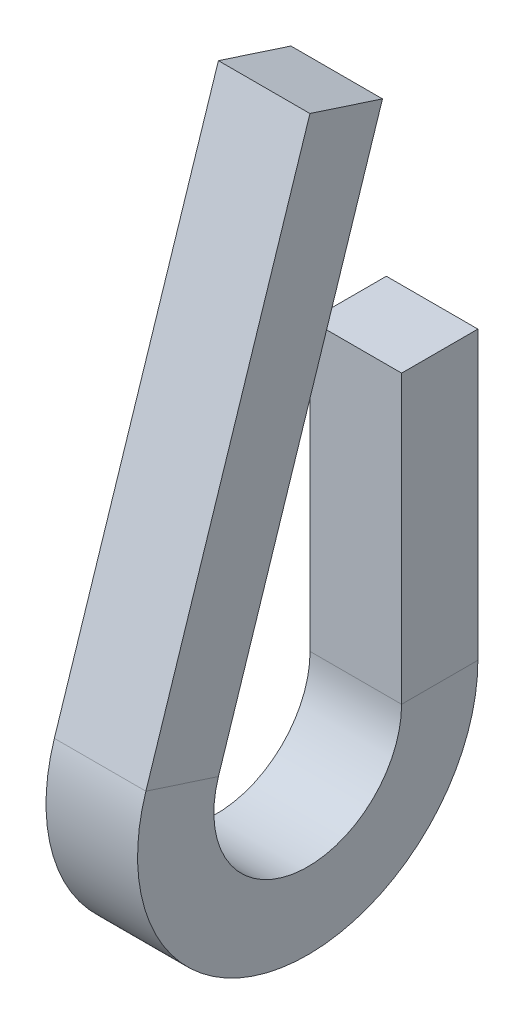
ISO-10303-21;
HEADER;
FILE_DESCRIPTION(('STEP AP214'),'2;1');
FILE_NAME('part.step','',(''),(''),'','','');
FILE_SCHEMA(('AUTOMOTIVE_DESIGN { 1 0 10303 214 1 1 1 1 }'));
ENDSEC;
DATA;
#1=APPLICATION_CONTEXT('core data for automotive mechanical design processes');
#2=APPLICATION_PROTOCOL_DEFINITION('international standard','automotive_design',2000,#1);
#3=PRODUCT_CONTEXT('',#1,'mechanical');
#4=PRODUCT('Part','Part','',(#3));
#5=PRODUCT_RELATED_PRODUCT_CATEGORY('part','',(#4));
#6=PRODUCT_DEFINITION_FORMATION('','',#4);
#7=PRODUCT_DEFINITION_CONTEXT('part definition',#1,'design');
#8=PRODUCT_DEFINITION('design','',#6,#7);
#9=PRODUCT_DEFINITION_SHAPE('','',#8);
#10=(LENGTH_UNIT() NAMED_UNIT(*) SI_UNIT(.MILLI.,.METRE.));
#11=(NAMED_UNIT(*) PLANE_ANGLE_UNIT() SI_UNIT($,.RADIAN.));
#12=(NAMED_UNIT(*) SI_UNIT($,.STERADIAN.) SOLID_ANGLE_UNIT());
#13=UNCERTAINTY_MEASURE_WITH_UNIT(LENGTH_MEASURE(1.E-05),#10,'distance_accuracy_value','');
#14=(GEOMETRIC_REPRESENTATION_CONTEXT(3) GLOBAL_UNCERTAINTY_ASSIGNED_CONTEXT((#13)) GLOBAL_UNIT_ASSIGNED_CONTEXT((#10,
#11,#12)) REPRESENTATION_CONTEXT('',''));
#15=CARTESIAN_POINT('',(0.,0.,0.));
#16=DIRECTION('',(0.,0.,1.));
#17=DIRECTION('',(1.,0.,0.));
#18=AXIS2_PLACEMENT_3D('',#15,#16,#17);
#19=CARTESIAN_POINT('',(0.,0.,0.));
#20=DIRECTION('',(0.,-1.,0.));
#21=DIRECTION('',(0.,0.,-1.));
#22=AXIS2_PLACEMENT_3D('',#19,#20,#21);
#23=PLANE('',#22);
#24=DIRECTION('',(0.,0.,-1.));
#25=VECTOR('',#24,1.);
#26=CARTESIAN_POINT('',(6.,0.,5.));
#27=LINE('',#26,#25);
#28=CARTESIAN_POINT('',(6.,0.,5.));
#29=VERTEX_POINT('',#28);
#30=CARTESIAN_POINT('',(6.,0.,-5.));
#31=VERTEX_POINT('',#30);
#32=EDGE_CURVE('E116',#29,#31,#27,.T.);
#33=ORIENTED_EDGE('',*,*,#32,.T.);
#34=DIRECTION('',(-1.,0.,0.));
#35=VECTOR('',#34,1.);
#36=CARTESIAN_POINT('',(-6.,0.,-5.));
#37=LINE('',#36,#35);
#38=CARTESIAN_POINT('',(-6.,0.,-5.));
#39=VERTEX_POINT('',#38);
#40=EDGE_CURVE('E126',#31,#39,#37,.T.);
#41=ORIENTED_EDGE('',*,*,#40,.T.);
#42=DIRECTION('',(0.,0.,1.));
#43=VECTOR('',#42,1.);
#44=CARTESIAN_POINT('',(-6.,0.,5.));
#45=LINE('',#44,#43);
#46=CARTESIAN_POINT('',(-6.,0.,5.));
#47=VERTEX_POINT('',#46);
#48=EDGE_CURVE('E130',#39,#47,#45,.T.);
#49=ORIENTED_EDGE('',*,*,#48,.T.);
#50=DIRECTION('',(1.,0.,0.));
#51=VECTOR('',#50,1.);
#52=CARTESIAN_POINT('',(-6.,0.,5.));
#53=LINE('',#52,#51);
#54=EDGE_CURVE('E129',#47,#29,#53,.T.);
#55=ORIENTED_EDGE('',*,*,#54,.T.);
#56=EDGE_LOOP('',(#33,#41,#49,#55));
#57=FACE_BOUND('',#56,.T.);
#58=ADVANCED_FACE('F32',(#57),#23,.F.);
#59=CARTESIAN_POINT('',(0.,33.9359199941308,12.2630312388335));
#60=DIRECTION('',(0.,0.95105651629522,-0.309016994374742));
#61=DIRECTION('',(0.,0.309016994374742,0.95105651629522));
#62=AXIS2_PLACEMENT_3D('',#59,#60,#61);
#63=PLANE('',#62);
#64=DIRECTION('',(0.,0.309016994374742,0.95105651629522));
#65=VECTOR('',#64,1.);
#66=CARTESIAN_POINT('',(6.,32.3908350222571,7.50774865735737));
#67=LINE('',#66,#65);
#68=CARTESIAN_POINT('',(6.,32.3908350222571,7.50774865735737));
#69=VERTEX_POINT('',#68);
#70=CARTESIAN_POINT('',(6.,35.4810049660045,17.0183138203096));
#71=VERTEX_POINT('',#70);
#72=EDGE_CURVE('E151',#69,#71,#67,.T.);
#73=ORIENTED_EDGE('',*,*,#72,.F.);
#74=DIRECTION('',(1.,0.,0.));
#75=VECTOR('',#74,1.);
#76=CARTESIAN_POINT('',(-6.,32.3908350222571,7.50774865735737));
#77=LINE('',#76,#75);
#78=CARTESIAN_POINT('',(-6.,32.3908350222571,7.50774865735737));
#79=VERTEX_POINT('',#78);
#80=EDGE_CURVE('E11',#79,#69,#77,.T.);
#81=ORIENTED_EDGE('',*,*,#80,.F.);
#82=DIRECTION('',(0.,-0.309016994374742,-0.95105651629522));
#83=VECTOR('',#82,1.);
#84=CARTESIAN_POINT('',(-6.,32.3908350222571,7.50774865735737));
#85=LINE('',#84,#83);
#86=CARTESIAN_POINT('',(-6.,35.4810049660045,17.0183138203096));
#87=VERTEX_POINT('',#86);
#88=EDGE_CURVE('E46',#87,#79,#85,.T.);
#89=ORIENTED_EDGE('',*,*,#88,.F.);
#90=DIRECTION('',(-1.,0.,0.));
#91=VECTOR('',#90,1.);
#92=CARTESIAN_POINT('',(-6.,35.4810049660045,17.0183138203096));
#93=LINE('',#92,#91);
#94=EDGE_CURVE('E55',#71,#87,#93,.T.);
#95=ORIENTED_EDGE('',*,*,#94,.F.);
#96=EDGE_LOOP('',(#73,#81,#89,#95));
#97=FACE_BOUND('',#96,.T.);
#98=ADVANCED_FACE('F212',(#97),#63,.T.);
#99=CARTESIAN_POINT('',(6.,0.,5.));
#100=DIRECTION('',(-1.,0.,0.));
#101=DIRECTION('',(0.,0.,1.));
#102=AXIS2_PLACEMENT_3D('',#99,#100,#101);
#103=PLANE('',#102);
#104=DIRECTION('',(0.,-1.,0.));
#105=VECTOR('',#104,1.);
#106=CARTESIAN_POINT('',(6.,0.,-5.));
#107=LINE('',#106,#105);
#108=CARTESIAN_POINT('',(6.,-37.597886470667,-5.));
#109=VERTEX_POINT('',#108);
#110=EDGE_CURVE('E123',#31,#109,#107,.T.);
#111=ORIENTED_EDGE('',*,*,#110,.F.);
#112=ORIENTED_EDGE('',*,*,#32,.F.);
#113=DIRECTION('',(0.,-1.,0.));
#114=VECTOR('',#113,1.);
#115=CARTESIAN_POINT('',(6.,0.,5.));
#116=LINE('',#115,#114);
#117=CARTESIAN_POINT('',(6.,-37.597886470667,5.));
#118=VERTEX_POINT('',#117);
#119=EDGE_CURVE('E121',#29,#118,#116,.T.);
#120=ORIENTED_EDGE('',*,*,#119,.T.);
#121=DIRECTION('',(0.,0.,-1.));
#122=VECTOR('',#121,1.);
#123=CARTESIAN_POINT('',(6.,-37.5978864706671,5.));
#124=LINE('',#123,#122);
#125=EDGE_CURVE('E139',#118,#109,#124,.T.);
#126=ORIENTED_EDGE('',*,*,#125,.T.);
#127=EDGE_LOOP('',(#111,#112,#120,#126));
#128=FACE_BOUND('',#127,.T.);
#129=ADVANCED_FACE('F118',(#128),#103,.F.);
#130=CARTESIAN_POINT('',(-6.,0.,-5.));
#131=DIRECTION('',(0.,0.,1.));
#132=DIRECTION('',(1.,0.,0.));
#133=AXIS2_PLACEMENT_3D('',#130,#131,#132);
#134=PLANE('',#133);
#135=DIRECTION('',(0.,-1.,0.));
#136=VECTOR('',#135,1.);
#137=CARTESIAN_POINT('',(-6.,0.,-5.));
#138=LINE('',#137,#136);
#139=CARTESIAN_POINT('',(-6.,-37.597886470667,-5.));
#140=VERTEX_POINT('',#139);
#141=EDGE_CURVE('E162',#39,#140,#138,.T.);
#142=ORIENTED_EDGE('',*,*,#141,.F.);
#143=ORIENTED_EDGE('',*,*,#40,.F.);
#144=ORIENTED_EDGE('',*,*,#110,.T.);
#145=DIRECTION('',(-1.,0.,0.));
#146=VECTOR('',#145,1.);
#147=CARTESIAN_POINT('',(-6.,-37.5978864706671,-5.));
#148=LINE('',#147,#146);
#149=EDGE_CURVE('E159',#109,#140,#148,.T.);
#150=ORIENTED_EDGE('',*,*,#149,.T.);
#151=EDGE_LOOP('',(#142,#143,#144,#150));
#152=FACE_BOUND('',#151,.T.);
#153=ADVANCED_FACE('F219',(#152),#134,.F.);
#154=CARTESIAN_POINT('',(-6.,0.,5.));
#155=DIRECTION('',(1.,0.,0.));
#156=DIRECTION('',(0.,0.,-1.));
#157=AXIS2_PLACEMENT_3D('',#154,#155,#156);
#158=PLANE('',#157);
#159=DIRECTION('',(0.,-1.,0.));
#160=VECTOR('',#159,1.);
#161=CARTESIAN_POINT('',(-6.,0.,5.));
#162=LINE('',#161,#160);
#163=CARTESIAN_POINT('',(-6.,-37.597886470667,5.));
#164=VERTEX_POINT('',#163);
#165=EDGE_CURVE('E174',#47,#164,#162,.T.);
#166=ORIENTED_EDGE('',*,*,#165,.F.);
#167=ORIENTED_EDGE('',*,*,#48,.F.);
#168=ORIENTED_EDGE('',*,*,#141,.T.);
#169=DIRECTION('',(0.,0.,1.));
#170=VECTOR('',#169,1.);
#171=CARTESIAN_POINT('',(-6.,-37.5978864706671,5.));
#172=LINE('',#171,#170);
#173=EDGE_CURVE('E165',#140,#164,#172,.T.);
#174=ORIENTED_EDGE('',*,*,#173,.T.);
#175=EDGE_LOOP('',(#166,#167,#168,#174));
#176=FACE_BOUND('',#175,.T.);
#177=ADVANCED_FACE('F198',(#176),#158,.F.);
#178=CARTESIAN_POINT('',(-6.,0.,5.));
#179=DIRECTION('',(0.,0.,-1.));
#180=DIRECTION('',(-1.,0.,0.));
#181=AXIS2_PLACEMENT_3D('',#178,#179,#180);
#182=PLANE('',#181);
#183=DIRECTION('',(1.,0.,0.));
#184=VECTOR('',#183,1.);
#185=CARTESIAN_POINT('',(-6.,-37.5978864706671,5.));
#186=LINE('',#185,#184);
#187=EDGE_CURVE('E138',#164,#118,#186,.T.);
#188=ORIENTED_EDGE('',*,*,#187,.T.);
#189=ORIENTED_EDGE('',*,*,#119,.F.);
#190=ORIENTED_EDGE('',*,*,#54,.F.);
#191=ORIENTED_EDGE('',*,*,#165,.T.);
#192=EDGE_LOOP('',(#188,#189,#190,#191));
#193=FACE_BOUND('',#192,.T.);
#194=ADVANCED_FACE('F136',(#193),#182,.F.);
#195=CARTESIAN_POINT('',(6.,-37.5978864706671,5.00000000000022));
#196=DIRECTION('',(-1.,0.,0.));
#197=DIRECTION('',(0.,0.,1.));
#198=AXIS2_PLACEMENT_3D('',#195,#196,#197);
#199=PLANE('',#198);
#200=CARTESIAN_POINT('',(6.,-37.5978864706671,17.3075445827073));
#201=DIRECTION('',(-1.,0.,0.));
#202=DIRECTION('',(0.,0.,-1.));
#203=AXIS2_PLACEMENT_3D('',#200,#201,#202);
#204=CIRCLE('',#203,22.3075445827071);
#205=CARTESIAN_POINT('',(6.,-30.7044760918382,38.523280220637));
#206=VERTEX_POINT('',#205);
#207=EDGE_CURVE('E104',#109,#206,#204,.T.);
#208=ORIENTED_EDGE('',*,*,#207,.F.);
#209=ORIENTED_EDGE('',*,*,#125,.F.);
#210=CARTESIAN_POINT('',(6.,-37.5978864706671,17.3075445827073));
#211=DIRECTION('',(-1.,0.,0.));
#212=DIRECTION('',(0.,0.,-1.));
#213=AXIS2_PLACEMENT_3D('',#210,#211,#212);
#214=CIRCLE('',#213,12.3075445827071);
#215=CARTESIAN_POINT('',(6.,-33.7946460355857,29.0127150576849));
#216=VERTEX_POINT('',#215);
#217=EDGE_CURVE('E146',#118,#216,#214,.T.);
#218=ORIENTED_EDGE('',*,*,#217,.T.);
#219=DIRECTION('',(0.,0.309016994374748,0.951056516295218));
#220=VECTOR('',#219,1.);
#221=CARTESIAN_POINT('',(6.,-33.7946460355857,29.0127150576849));
#222=LINE('',#221,#220);
#223=EDGE_CURVE('E144',#216,#206,#222,.T.);
#224=ORIENTED_EDGE('',*,*,#223,.T.);
#225=EDGE_LOOP('',(#208,#209,#218,#224));
#226=FACE_BOUND('',#225,.T.);
#227=ADVANCED_FACE('F188',(#226),#199,.F.);
#228=CARTESIAN_POINT('',(0.,-37.5978864706671,17.3075445827073));
#229=DIRECTION('',(-1.,0.,0.));
#230=DIRECTION('',(0.,0.,1.));
#231=AXIS2_PLACEMENT_3D('',#228,#229,#230);
#232=CYLINDRICAL_SURFACE('',#231,22.3075445827071);
#233=CARTESIAN_POINT('',(-6.,-37.5978864706671,17.3075445827073));
#234=DIRECTION('',(-1.,0.,0.));
#235=DIRECTION('',(0.,0.,-1.));
#236=AXIS2_PLACEMENT_3D('',#233,#234,#235);
#237=CIRCLE('',#236,22.3075445827071);
#238=CARTESIAN_POINT('',(-6.,-30.7044760918382,38.523280220637));
#239=VERTEX_POINT('',#238);
#240=EDGE_CURVE('E97',#140,#239,#237,.T.);
#241=ORIENTED_EDGE('',*,*,#240,.F.);
#242=ORIENTED_EDGE('',*,*,#149,.F.);
#243=ORIENTED_EDGE('',*,*,#207,.T.);
#244=DIRECTION('',(-1.,0.,0.));
#245=VECTOR('',#244,1.);
#246=CARTESIAN_POINT('',(-6.,-30.7044760918382,38.523280220637));
#247=LINE('',#246,#245);
#248=EDGE_CURVE('E148',#206,#239,#247,.T.);
#249=ORIENTED_EDGE('',*,*,#248,.T.);
#250=EDGE_LOOP('',(#241,#242,#243,#249));
#251=FACE_BOUND('',#250,.T.);
#252=ADVANCED_FACE('F190',(#251),#232,.T.);
#253=CARTESIAN_POINT('',(-6.,-37.5978864706671,5.00000000000022));
#254=DIRECTION('',(1.,0.,0.));
#255=DIRECTION('',(0.,0.,-1.));
#256=AXIS2_PLACEMENT_3D('',#253,#254,#255);
#257=PLANE('',#256);
#258=CARTESIAN_POINT('',(-6.,-37.5978864706671,17.3075445827073));
#259=DIRECTION('',(-1.,0.,0.));
#260=DIRECTION('',(0.,0.,-1.));
#261=AXIS2_PLACEMENT_3D('',#258,#259,#260);
#262=CIRCLE('',#261,12.3075445827071);
#263=CARTESIAN_POINT('',(-6.,-33.7946460355857,29.0127150576849));
#264=VERTEX_POINT('',#263);
#265=EDGE_CURVE('E178',#164,#264,#262,.T.);
#266=ORIENTED_EDGE('',*,*,#265,.F.);
#267=ORIENTED_EDGE('',*,*,#173,.F.);
#268=ORIENTED_EDGE('',*,*,#240,.T.);
#269=DIRECTION('',(0.,-0.309016994374748,-0.951056516295218));
#270=VECTOR('',#269,1.);
#271=CARTESIAN_POINT('',(-6.,-33.7946460355857,29.0127150576849));
#272=LINE('',#271,#270);
#273=EDGE_CURVE('E168',#239,#264,#272,.T.);
#274=ORIENTED_EDGE('',*,*,#273,.T.);
#275=EDGE_LOOP('',(#266,#267,#268,#274));
#276=FACE_BOUND('',#275,.T.);
#277=ADVANCED_FACE('F196',(#276),#257,.F.);
#278=CARTESIAN_POINT('',(0.,-37.5978864706671,17.3075445827073));
#279=DIRECTION('',(-1.,0.,0.));
#280=DIRECTION('',(0.,0.,1.));
#281=AXIS2_PLACEMENT_3D('',#278,#279,#280);
#282=CYLINDRICAL_SURFACE('',#281,12.3075445827071);
#283=DIRECTION('',(1.,0.,0.));
#284=VECTOR('',#283,1.);
#285=CARTESIAN_POINT('',(-6.,-33.7946460355857,29.0127150576849));
#286=LINE('',#285,#284);
#287=EDGE_CURVE('E157',#264,#216,#286,.T.);
#288=ORIENTED_EDGE('',*,*,#287,.T.);
#289=ORIENTED_EDGE('',*,*,#217,.F.);
#290=ORIENTED_EDGE('',*,*,#187,.F.);
#291=ORIENTED_EDGE('',*,*,#265,.T.);
#292=EDGE_LOOP('',(#288,#289,#290,#291));
#293=FACE_BOUND('',#292,.T.);
#294=ADVANCED_FACE('F185',(#293),#282,.F.);
#295=CARTESIAN_POINT('',(6.,-33.7946460355857,29.0127150576846));
#296=DIRECTION('',(-1.,0.,0.));
#297=DIRECTION('',(0.,0.,1.));
#298=AXIS2_PLACEMENT_3D('',#295,#296,#297);
#299=PLANE('',#298);
#300=DIRECTION('',(0.,0.95105651629522,-0.309016994374742));
#301=VECTOR('',#300,1.);
#302=CARTESIAN_POINT('',(6.,-30.7044760918383,38.5232802206368));
#303=LINE('',#302,#301);
#304=EDGE_CURVE('E84',#206,#71,#303,.T.);
#305=ORIENTED_EDGE('',*,*,#304,.F.);
#306=ORIENTED_EDGE('',*,*,#223,.F.);
#307=DIRECTION('',(0.,0.95105651629522,-0.309016994374742));
#308=VECTOR('',#307,1.);
#309=CARTESIAN_POINT('',(6.,-33.7946460355857,29.0127150576846));
#310=LINE('',#309,#308);
#311=EDGE_CURVE('E153',#216,#69,#310,.T.);
#312=ORIENTED_EDGE('',*,*,#311,.T.);
#313=ORIENTED_EDGE('',*,*,#72,.T.);
#314=EDGE_LOOP('',(#305,#306,#312,#313));
#315=FACE_BOUND('',#314,.T.);
#316=ADVANCED_FACE('F187',(#315),#299,.F.);
#317=CARTESIAN_POINT('',(-6.,-30.7044760918383,38.5232802206368));
#318=DIRECTION('',(0.,-0.309016994374742,-0.95105651629522));
#319=DIRECTION('',(0.,0.95105651629522,-0.309016994374742));
#320=AXIS2_PLACEMENT_3D('',#317,#318,#319);
#321=PLANE('',#320);
#322=DIRECTION('',(0.,0.95105651629522,-0.309016994374742));
#323=VECTOR('',#322,1.);
#324=CARTESIAN_POINT('',(-6.,-30.7044760918383,38.5232802206368));
#325=LINE('',#324,#323);
#326=EDGE_CURVE('E79',#239,#87,#325,.T.);
#327=ORIENTED_EDGE('',*,*,#326,.F.);
#328=ORIENTED_EDGE('',*,*,#248,.F.);
#329=ORIENTED_EDGE('',*,*,#304,.T.);
#330=ORIENTED_EDGE('',*,*,#94,.T.);
#331=EDGE_LOOP('',(#327,#328,#329,#330));
#332=FACE_BOUND('',#331,.T.);
#333=ADVANCED_FACE('F209',(#332),#321,.F.);
#334=CARTESIAN_POINT('',(-6.,-33.7946460355857,29.0127150576846));
#335=DIRECTION('',(1.,0.,0.));
#336=DIRECTION('',(0.,0.,-1.));
#337=AXIS2_PLACEMENT_3D('',#334,#335,#336);
#338=PLANE('',#337);
#339=DIRECTION('',(0.,0.95105651629522,-0.309016994374742));
#340=VECTOR('',#339,1.);
#341=CARTESIAN_POINT('',(-6.,-33.7946460355857,29.0127150576846));
#342=LINE('',#341,#340);
#343=EDGE_CURVE('E39',#264,#79,#342,.T.);
#344=ORIENTED_EDGE('',*,*,#343,.F.);
#345=ORIENTED_EDGE('',*,*,#273,.F.);
#346=ORIENTED_EDGE('',*,*,#326,.T.);
#347=ORIENTED_EDGE('',*,*,#88,.T.);
#348=EDGE_LOOP('',(#344,#345,#346,#347));
#349=FACE_BOUND('',#348,.T.);
#350=ADVANCED_FACE('F204',(#349),#338,.F.);
#351=CARTESIAN_POINT('',(-6.,-33.7946460355857,29.0127150576846));
#352=DIRECTION('',(0.,0.309016994374742,0.95105651629522));
#353=DIRECTION('',(0.,-0.95105651629522,0.309016994374742));
#354=AXIS2_PLACEMENT_3D('',#351,#352,#353);
#355=PLANE('',#354);
#356=ORIENTED_EDGE('',*,*,#80,.T.);
#357=ORIENTED_EDGE('',*,*,#311,.F.);
#358=ORIENTED_EDGE('',*,*,#287,.F.);
#359=ORIENTED_EDGE('',*,*,#343,.T.);
#360=EDGE_LOOP('',(#356,#357,#358,#359));
#361=FACE_BOUND('',#360,.T.);
#362=ADVANCED_FACE('F202',(#361),#355,.F.);
#363=CLOSED_SHELL('',(#58,#98,#129,#153,#177,#194,#227,#252,#277,#294,#316,#333,#350,#362));
#364=MANIFOLD_SOLID_BREP('B2',#363);
#365=ADVANCED_BREP_SHAPE_REPRESENTATION('',(#18,#364),#14);
#366=SHAPE_DEFINITION_REPRESENTATION(#9,#365);
ENDSEC;
END-ISO-10303-21;
